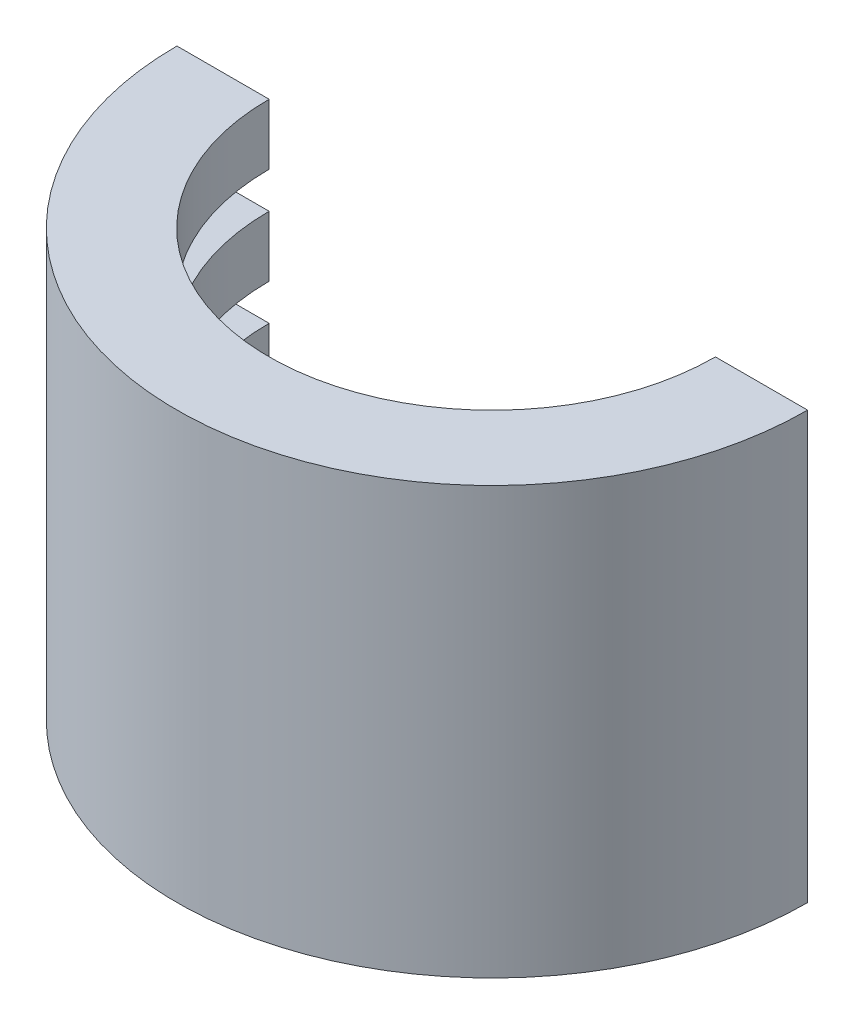
ISO-10303-21;
HEADER;
FILE_DESCRIPTION(('STEP AP214'),'2;1');
FILE_NAME('part.step','',(''),(''),'','','');
FILE_SCHEMA(('AUTOMOTIVE_DESIGN { 1 0 10303 214 1 1 1 1 }'));
ENDSEC;
DATA;
#1=APPLICATION_CONTEXT('core data for automotive mechanical design processes');
#2=APPLICATION_PROTOCOL_DEFINITION('international standard','automotive_design',2000,#1);
#3=PRODUCT_CONTEXT('',#1,'mechanical');
#4=PRODUCT('Part','Part','',(#3));
#5=PRODUCT_RELATED_PRODUCT_CATEGORY('part','',(#4));
#6=PRODUCT_DEFINITION_FORMATION('','',#4);
#7=PRODUCT_DEFINITION_CONTEXT('part definition',#1,'design');
#8=PRODUCT_DEFINITION('design','',#6,#7);
#9=PRODUCT_DEFINITION_SHAPE('','',#8);
#10=(LENGTH_UNIT() NAMED_UNIT(*) SI_UNIT(.MILLI.,.METRE.));
#11=(NAMED_UNIT(*) PLANE_ANGLE_UNIT() SI_UNIT($,.RADIAN.));
#12=(NAMED_UNIT(*) SI_UNIT($,.STERADIAN.) SOLID_ANGLE_UNIT());
#13=UNCERTAINTY_MEASURE_WITH_UNIT(LENGTH_MEASURE(1.E-05),#10,'distance_accuracy_value','');
#14=(GEOMETRIC_REPRESENTATION_CONTEXT(3) GLOBAL_UNCERTAINTY_ASSIGNED_CONTEXT((#13)) GLOBAL_UNIT_ASSIGNED_CONTEXT((#10,
#11,#12)) REPRESENTATION_CONTEXT('',''));
#15=CARTESIAN_POINT('',(0.,0.,0.));
#16=DIRECTION('',(0.,0.,1.));
#17=DIRECTION('',(1.,0.,0.));
#18=AXIS2_PLACEMENT_3D('',#15,#16,#17);
#19=CARTESIAN_POINT('',(0.,2.,0.));
#20=DIRECTION('',(0.,1.,0.));
#21=DIRECTION('',(-1.,0.,0.));
#22=AXIS2_PLACEMENT_3D('',#19,#20,#21);
#23=PLANE('',#22);
#24=DIRECTION('',(1.,0.,0.));
#25=VECTOR('',#24,1.);
#26=CARTESIAN_POINT('',(0.,2.,0.));
#27=LINE('',#26,#25);
#28=CARTESIAN_POINT('',(-1.5,2.,0.));
#29=VERTEX_POINT('',#28);
#30=CARTESIAN_POINT('',(1.5,2.,0.));
#31=VERTEX_POINT('',#30);
#32=EDGE_CURVE('E201',#29,#31,#27,.T.);
#33=ORIENTED_EDGE('',*,*,#32,.F.);
#34=CARTESIAN_POINT('',(0.,2.,0.));
#35=DIRECTION('',(0.,1.,0.));
#36=DIRECTION('',(-1.,0.,0.));
#37=AXIS2_PLACEMENT_3D('',#34,#35,#36);
#38=CIRCLE('',#37,1.5);
#39=EDGE_CURVE('E209',#29,#31,#38,.T.);
#40=ORIENTED_EDGE('',*,*,#39,.T.);
#41=EDGE_LOOP('',(#33,#40));
#42=FACE_BOUND('',#41,.T.);
#43=ADVANCED_FACE('F37',(#42),#23,.T.);
#44=CARTESIAN_POINT('',(0.,-1.58456842119819,0.));
#45=DIRECTION('',(0.,1.,0.));
#46=DIRECTION('',(-1.,0.,0.));
#47=AXIS2_PLACEMENT_3D('',#44,#45,#46);
#48=PLANE('',#47);
#49=CARTESIAN_POINT('',(0.,-1.58456842119819,0.));
#50=DIRECTION('',(0.,1.,0.));
#51=DIRECTION('',(-1.,0.,0.));
#52=AXIS2_PLACEMENT_3D('',#49,#50,#51);
#53=CIRCLE('',#52,13.);
#54=CARTESIAN_POINT('',(-13.,-1.58456842119818,0.));
#55=VERTEX_POINT('',#54);
#56=CARTESIAN_POINT('',(13.,-1.58456842119818,0.));
#57=VERTEX_POINT('',#56);
#58=EDGE_CURVE('E194',#55,#57,#53,.T.);
#59=ORIENTED_EDGE('',*,*,#58,.F.);
#60=DIRECTION('',(1.,0.,0.));
#61=VECTOR('',#60,1.);
#62=CARTESIAN_POINT('',(0.,-1.58456842119819,0.));
#63=LINE('',#62,#61);
#64=EDGE_CURVE('E175',#55,#57,#63,.T.);
#65=ORIENTED_EDGE('',*,*,#64,.T.);
#66=EDGE_LOOP('',(#59,#65));
#67=FACE_BOUND('',#66,.T.);
#68=ADVANCED_FACE('F342',(#67),#48,.F.);
#69=CARTESIAN_POINT('',(0.,18.,0.));
#70=DIRECTION('',(0.,1.,0.));
#71=DIRECTION('',(-1.,0.,0.));
#72=AXIS2_PLACEMENT_3D('',#69,#70,#71);
#73=CYLINDRICAL_SURFACE('',#72,13.);
#74=DIRECTION('',(0.,1.,0.));
#75=VECTOR('',#74,1.);
#76=CARTESIAN_POINT('',(13.,-4.,0.));
#77=LINE('',#76,#75);
#78=CARTESIAN_POINT('',(13.,16.,0.));
#79=VERTEX_POINT('',#78);
#80=EDGE_CURVE('E180',#57,#79,#77,.T.);
#81=ORIENTED_EDGE('',*,*,#80,.T.);
#82=CARTESIAN_POINT('',(0.,16.,0.));
#83=DIRECTION('',(0.,1.,0.));
#84=DIRECTION('',(-1.,0.,0.));
#85=AXIS2_PLACEMENT_3D('',#82,#83,#84);
#86=CIRCLE('',#85,13.);
#87=CARTESIAN_POINT('',(-13.,16.,0.));
#88=VERTEX_POINT('',#87);
#89=EDGE_CURVE('E187',#88,#79,#86,.T.);
#90=ORIENTED_EDGE('',*,*,#89,.F.);
#91=DIRECTION('',(0.,1.,0.));
#92=VECTOR('',#91,1.);
#93=CARTESIAN_POINT('',(-13.,-4.,0.));
#94=LINE('',#93,#92);
#95=EDGE_CURVE('E169',#55,#88,#94,.T.);
#96=ORIENTED_EDGE('',*,*,#95,.F.);
#97=ORIENTED_EDGE('',*,*,#58,.T.);
#98=EDGE_LOOP('',(#81,#90,#96,#97));
#99=FACE_BOUND('',#98,.T.);
#100=ADVANCED_FACE('F193',(#99),#73,.T.);
#101=CARTESIAN_POINT('',(0.,16.,0.));
#102=DIRECTION('',(0.,-1.,0.));
#103=DIRECTION('',(1.,0.,0.));
#104=AXIS2_PLACEMENT_3D('',#101,#102,#103);
#105=PLANE('',#104);
#106=ORIENTED_EDGE('',*,*,#89,.T.);
#107=DIRECTION('',(1.,0.,0.));
#108=VECTOR('',#107,1.);
#109=CARTESIAN_POINT('',(-13.,16.,0.));
#110=LINE('',#109,#108);
#111=CARTESIAN_POINT('',(9.2,16.,0.));
#112=VERTEX_POINT('',#111);
#113=EDGE_CURVE('E190',#112,#79,#110,.T.);
#114=ORIENTED_EDGE('',*,*,#113,.F.);
#115=CARTESIAN_POINT('',(0.,16.,0.));
#116=DIRECTION('',(0.,1.,0.));
#117=DIRECTION('',(-1.,0.,0.));
#118=AXIS2_PLACEMENT_3D('',#115,#116,#117);
#119=CIRCLE('',#118,9.2);
#120=CARTESIAN_POINT('',(-9.2,16.,0.));
#121=VERTEX_POINT('',#120);
#122=EDGE_CURVE('E189',#121,#112,#119,.T.);
#123=ORIENTED_EDGE('',*,*,#122,.F.);
#124=EDGE_CURVE('E172',#88,#121,#110,.T.);
#125=ORIENTED_EDGE('',*,*,#124,.F.);
#126=EDGE_LOOP('',(#106,#114,#123,#125));
#127=FACE_BOUND('',#126,.T.);
#128=ADVANCED_FACE('F185',(#127),#105,.F.);
#129=CARTESIAN_POINT('',(0.,18.,0.));
#130=DIRECTION('',(0.,1.,0.));
#131=DIRECTION('',(-1.,0.,0.));
#132=AXIS2_PLACEMENT_3D('',#129,#130,#131);
#133=CYLINDRICAL_SURFACE('',#132,9.2);
#134=DIRECTION('',(0.,1.,0.));
#135=VECTOR('',#134,1.);
#136=CARTESIAN_POINT('',(9.2,18.,0.));
#137=LINE('',#136,#135);
#138=CARTESIAN_POINT('',(9.2,13.5,0.));
#139=VERTEX_POINT('',#138);
#140=EDGE_CURVE('E218',#139,#112,#137,.T.);
#141=ORIENTED_EDGE('',*,*,#140,.F.);
#142=CARTESIAN_POINT('',(0.,13.5,0.));
#143=DIRECTION('',(0.,1.,0.));
#144=DIRECTION('',(-1.,0.,0.));
#145=AXIS2_PLACEMENT_3D('',#142,#143,#144);
#146=CIRCLE('',#145,9.2);
#147=CARTESIAN_POINT('',(-9.2,13.5,0.));
#148=VERTEX_POINT('',#147);
#149=EDGE_CURVE('E197',#148,#139,#146,.T.);
#150=ORIENTED_EDGE('',*,*,#149,.F.);
#151=DIRECTION('',(0.,1.,0.));
#152=VECTOR('',#151,1.);
#153=CARTESIAN_POINT('',(-9.2,18.,0.));
#154=LINE('',#153,#152);
#155=EDGE_CURVE('E211',#121,#148,#154,.F.);
#156=ORIENTED_EDGE('',*,*,#155,.F.);
#157=ORIENTED_EDGE('',*,*,#122,.T.);
#158=EDGE_LOOP('',(#141,#150,#156,#157));
#159=FACE_BOUND('',#158,.T.);
#160=ADVANCED_FACE('F270',(#159),#133,.F.);
#161=CARTESIAN_POINT('',(0.,13.5,0.));
#162=DIRECTION('',(0.,-1.,0.));
#163=DIRECTION('',(1.,0.,0.));
#164=AXIS2_PLACEMENT_3D('',#161,#162,#163);
#165=PLANE('',#164);
#166=DIRECTION('',(-1.,0.,0.));
#167=VECTOR('',#166,1.);
#168=CARTESIAN_POINT('',(0.,13.5,0.));
#169=LINE('',#168,#167);
#170=CARTESIAN_POINT('',(11.,13.5,0.));
#171=VERTEX_POINT('',#170);
#172=EDGE_CURVE('E58',#171,#139,#169,.T.);
#173=ORIENTED_EDGE('',*,*,#172,.F.);
#174=CARTESIAN_POINT('',(0.,13.5,0.));
#175=DIRECTION('',(0.,1.,0.));
#176=DIRECTION('',(-1.,0.,0.));
#177=AXIS2_PLACEMENT_3D('',#174,#175,#176);
#178=CIRCLE('',#177,11.);
#179=CARTESIAN_POINT('',(-11.,13.5,0.));
#180=VERTEX_POINT('',#179);
#181=EDGE_CURVE('E260',#180,#171,#178,.T.);
#182=ORIENTED_EDGE('',*,*,#181,.F.);
#183=EDGE_CURVE('E268',#148,#180,#169,.T.);
#184=ORIENTED_EDGE('',*,*,#183,.F.);
#185=ORIENTED_EDGE('',*,*,#149,.T.);
#186=EDGE_LOOP('',(#173,#182,#184,#185));
#187=FACE_BOUND('',#186,.T.);
#188=ADVANCED_FACE('F266',(#187),#165,.T.);
#189=CARTESIAN_POINT('',(0.,18.,0.));
#190=DIRECTION('',(0.,1.,0.));
#191=DIRECTION('',(-1.,0.,0.));
#192=AXIS2_PLACEMENT_3D('',#189,#190,#191);
#193=CYLINDRICAL_SURFACE('',#192,11.);
#194=DIRECTION('',(0.,1.,0.));
#195=VECTOR('',#194,1.);
#196=CARTESIAN_POINT('',(11.,18.,0.));
#197=LINE('',#196,#195);
#198=CARTESIAN_POINT('',(11.,12.,0.));
#199=VERTEX_POINT('',#198);
#200=EDGE_CURVE('E271',#199,#171,#197,.T.);
#201=ORIENTED_EDGE('',*,*,#200,.F.);
#202=CARTESIAN_POINT('',(0.,12.,0.));
#203=DIRECTION('',(0.,1.,0.));
#204=DIRECTION('',(-1.,0.,0.));
#205=AXIS2_PLACEMENT_3D('',#202,#203,#204);
#206=CIRCLE('',#205,11.);
#207=CARTESIAN_POINT('',(-11.,12.,0.));
#208=VERTEX_POINT('',#207);
#209=EDGE_CURVE('E257',#208,#199,#206,.T.);
#210=ORIENTED_EDGE('',*,*,#209,.F.);
#211=DIRECTION('',(0.,1.,0.));
#212=VECTOR('',#211,1.);
#213=CARTESIAN_POINT('',(-11.,18.,0.));
#214=LINE('',#213,#212);
#215=EDGE_CURVE('E294',#180,#208,#214,.F.);
#216=ORIENTED_EDGE('',*,*,#215,.F.);
#217=ORIENTED_EDGE('',*,*,#181,.T.);
#218=EDGE_LOOP('',(#201,#210,#216,#217));
#219=FACE_BOUND('',#218,.T.);
#220=ADVANCED_FACE('F358',(#219),#193,.F.);
#221=CARTESIAN_POINT('',(0.,12.,0.));
#222=DIRECTION('',(0.,1.,0.));
#223=DIRECTION('',(-1.,0.,0.));
#224=AXIS2_PLACEMENT_3D('',#221,#222,#223);
#225=PLANE('',#224);
#226=DIRECTION('',(1.,0.,0.));
#227=VECTOR('',#226,1.);
#228=CARTESIAN_POINT('',(0.,12.,0.));
#229=LINE('',#228,#227);
#230=CARTESIAN_POINT('',(-9.2,12.,0.));
#231=VERTEX_POINT('',#230);
#232=EDGE_CURVE('E296',#208,#231,#229,.T.);
#233=ORIENTED_EDGE('',*,*,#232,.F.);
#234=ORIENTED_EDGE('',*,*,#209,.T.);
#235=CARTESIAN_POINT('',(9.2,12.,0.));
#236=VERTEX_POINT('',#235);
#237=EDGE_CURVE('E275',#236,#199,#229,.T.);
#238=ORIENTED_EDGE('',*,*,#237,.F.);
#239=CARTESIAN_POINT('',(0.,12.,0.));
#240=DIRECTION('',(0.,1.,0.));
#241=DIRECTION('',(-1.,0.,0.));
#242=AXIS2_PLACEMENT_3D('',#239,#240,#241);
#243=CIRCLE('',#242,9.2);
#244=EDGE_CURVE('E254',#231,#236,#243,.T.);
#245=ORIENTED_EDGE('',*,*,#244,.F.);
#246=EDGE_LOOP('',(#233,#234,#238,#245));
#247=FACE_BOUND('',#246,.T.);
#248=ADVANCED_FACE('F361',(#247),#225,.T.);
#249=CARTESIAN_POINT('',(0.,18.,0.));
#250=DIRECTION('',(0.,1.,0.));
#251=DIRECTION('',(-1.,0.,0.));
#252=AXIS2_PLACEMENT_3D('',#249,#250,#251);
#253=CYLINDRICAL_SURFACE('',#252,9.2);
#254=DIRECTION('',(0.,1.,0.));
#255=VECTOR('',#254,1.);
#256=CARTESIAN_POINT('',(9.2,18.,0.));
#257=LINE('',#256,#255);
#258=CARTESIAN_POINT('',(9.2,9.5,0.));
#259=VERTEX_POINT('',#258);
#260=EDGE_CURVE('E276',#259,#236,#257,.T.);
#261=ORIENTED_EDGE('',*,*,#260,.F.);
#262=CARTESIAN_POINT('',(0.,9.5,0.));
#263=DIRECTION('',(0.,1.,0.));
#264=DIRECTION('',(-1.,0.,0.));
#265=AXIS2_PLACEMENT_3D('',#262,#263,#264);
#266=CIRCLE('',#265,9.2);
#267=CARTESIAN_POINT('',(-9.2,9.5,0.));
#268=VERTEX_POINT('',#267);
#269=EDGE_CURVE('E251',#268,#259,#266,.T.);
#270=ORIENTED_EDGE('',*,*,#269,.F.);
#271=DIRECTION('',(0.,1.,0.));
#272=VECTOR('',#271,1.);
#273=CARTESIAN_POINT('',(-9.2,18.,0.));
#274=LINE('',#273,#272);
#275=EDGE_CURVE('E298',#231,#268,#274,.F.);
#276=ORIENTED_EDGE('',*,*,#275,.F.);
#277=ORIENTED_EDGE('',*,*,#244,.T.);
#278=EDGE_LOOP('',(#261,#270,#276,#277));
#279=FACE_BOUND('',#278,.T.);
#280=ADVANCED_FACE('F365',(#279),#253,.F.);
#281=CARTESIAN_POINT('',(0.,9.5,0.));
#282=DIRECTION('',(0.,-1.,0.));
#283=DIRECTION('',(1.,0.,0.));
#284=AXIS2_PLACEMENT_3D('',#281,#282,#283);
#285=PLANE('',#284);
#286=DIRECTION('',(-1.,0.,0.));
#287=VECTOR('',#286,1.);
#288=CARTESIAN_POINT('',(0.,9.5,0.));
#289=LINE('',#288,#287);
#290=CARTESIAN_POINT('',(11.,9.5,0.));
#291=VERTEX_POINT('',#290);
#292=EDGE_CURVE('E278',#291,#259,#289,.T.);
#293=ORIENTED_EDGE('',*,*,#292,.F.);
#294=CARTESIAN_POINT('',(0.,9.5,0.));
#295=DIRECTION('',(0.,1.,0.));
#296=DIRECTION('',(-1.,0.,0.));
#297=AXIS2_PLACEMENT_3D('',#294,#295,#296);
#298=CIRCLE('',#297,11.);
#299=CARTESIAN_POINT('',(-11.,9.5,0.));
#300=VERTEX_POINT('',#299);
#301=EDGE_CURVE('E248',#300,#291,#298,.T.);
#302=ORIENTED_EDGE('',*,*,#301,.F.);
#303=EDGE_CURVE('E300',#268,#300,#289,.T.);
#304=ORIENTED_EDGE('',*,*,#303,.F.);
#305=ORIENTED_EDGE('',*,*,#269,.T.);
#306=EDGE_LOOP('',(#293,#302,#304,#305));
#307=FACE_BOUND('',#306,.T.);
#308=ADVANCED_FACE('F369',(#307),#285,.T.);
#309=CARTESIAN_POINT('',(0.,18.,0.));
#310=DIRECTION('',(0.,1.,0.));
#311=DIRECTION('',(-1.,0.,0.));
#312=AXIS2_PLACEMENT_3D('',#309,#310,#311);
#313=CYLINDRICAL_SURFACE('',#312,11.);
#314=DIRECTION('',(0.,1.,0.));
#315=VECTOR('',#314,1.);
#316=CARTESIAN_POINT('',(11.,18.,0.));
#317=LINE('',#316,#315);
#318=CARTESIAN_POINT('',(11.,8.,0.));
#319=VERTEX_POINT('',#318);
#320=EDGE_CURVE('E279',#319,#291,#317,.T.);
#321=ORIENTED_EDGE('',*,*,#320,.F.);
#322=CARTESIAN_POINT('',(0.,8.,0.));
#323=DIRECTION('',(0.,1.,0.));
#324=DIRECTION('',(-1.,0.,0.));
#325=AXIS2_PLACEMENT_3D('',#322,#323,#324);
#326=CIRCLE('',#325,11.);
#327=CARTESIAN_POINT('',(-11.,8.,0.));
#328=VERTEX_POINT('',#327);
#329=EDGE_CURVE('E245',#328,#319,#326,.T.);
#330=ORIENTED_EDGE('',*,*,#329,.F.);
#331=DIRECTION('',(0.,1.,0.));
#332=VECTOR('',#331,1.);
#333=CARTESIAN_POINT('',(-11.,18.,0.));
#334=LINE('',#333,#332);
#335=EDGE_CURVE('E302',#300,#328,#334,.F.);
#336=ORIENTED_EDGE('',*,*,#335,.F.);
#337=ORIENTED_EDGE('',*,*,#301,.T.);
#338=EDGE_LOOP('',(#321,#330,#336,#337));
#339=FACE_BOUND('',#338,.T.);
#340=ADVANCED_FACE('F373',(#339),#313,.F.);
#341=CARTESIAN_POINT('',(0.,8.,0.));
#342=DIRECTION('',(0.,1.,0.));
#343=DIRECTION('',(-1.,0.,0.));
#344=AXIS2_PLACEMENT_3D('',#341,#342,#343);
#345=PLANE('',#344);
#346=DIRECTION('',(1.,0.,0.));
#347=VECTOR('',#346,1.);
#348=CARTESIAN_POINT('',(0.,8.,0.));
#349=LINE('',#348,#347);
#350=CARTESIAN_POINT('',(-9.2,8.,0.));
#351=VERTEX_POINT('',#350);
#352=EDGE_CURVE('E304',#328,#351,#349,.T.);
#353=ORIENTED_EDGE('',*,*,#352,.F.);
#354=ORIENTED_EDGE('',*,*,#329,.T.);
#355=CARTESIAN_POINT('',(9.2,8.,0.));
#356=VERTEX_POINT('',#355);
#357=EDGE_CURVE('E281',#356,#319,#349,.T.);
#358=ORIENTED_EDGE('',*,*,#357,.F.);
#359=CARTESIAN_POINT('',(0.,8.,0.));
#360=DIRECTION('',(0.,1.,0.));
#361=DIRECTION('',(-1.,0.,0.));
#362=AXIS2_PLACEMENT_3D('',#359,#360,#361);
#363=CIRCLE('',#362,9.2);
#364=EDGE_CURVE('E242',#351,#356,#363,.T.);
#365=ORIENTED_EDGE('',*,*,#364,.F.);
#366=EDGE_LOOP('',(#353,#354,#358,#365));
#367=FACE_BOUND('',#366,.T.);
#368=ADVANCED_FACE('F377',(#367),#345,.T.);
#369=CARTESIAN_POINT('',(0.,18.,0.));
#370=DIRECTION('',(0.,1.,0.));
#371=DIRECTION('',(-1.,0.,0.));
#372=AXIS2_PLACEMENT_3D('',#369,#370,#371);
#373=CYLINDRICAL_SURFACE('',#372,9.2);
#374=DIRECTION('',(0.,1.,0.));
#375=VECTOR('',#374,1.);
#376=CARTESIAN_POINT('',(9.2,18.,0.));
#377=LINE('',#376,#375);
#378=CARTESIAN_POINT('',(9.2,5.5,0.));
#379=VERTEX_POINT('',#378);
#380=EDGE_CURVE('E282',#379,#356,#377,.T.);
#381=ORIENTED_EDGE('',*,*,#380,.F.);
#382=CARTESIAN_POINT('',(0.,5.5,0.));
#383=DIRECTION('',(0.,1.,0.));
#384=DIRECTION('',(-1.,0.,0.));
#385=AXIS2_PLACEMENT_3D('',#382,#383,#384);
#386=CIRCLE('',#385,9.2);
#387=CARTESIAN_POINT('',(-9.2,5.5,0.));
#388=VERTEX_POINT('',#387);
#389=EDGE_CURVE('E239',#388,#379,#386,.T.);
#390=ORIENTED_EDGE('',*,*,#389,.F.);
#391=DIRECTION('',(0.,1.,0.));
#392=VECTOR('',#391,1.);
#393=CARTESIAN_POINT('',(-9.2,18.,0.));
#394=LINE('',#393,#392);
#395=EDGE_CURVE('E306',#351,#388,#394,.F.);
#396=ORIENTED_EDGE('',*,*,#395,.F.);
#397=ORIENTED_EDGE('',*,*,#364,.T.);
#398=EDGE_LOOP('',(#381,#390,#396,#397));
#399=FACE_BOUND('',#398,.T.);
#400=ADVANCED_FACE('F381',(#399),#373,.F.);
#401=CARTESIAN_POINT('',(0.,5.5,0.));
#402=DIRECTION('',(0.,-1.,0.));
#403=DIRECTION('',(1.,0.,0.));
#404=AXIS2_PLACEMENT_3D('',#401,#402,#403);
#405=PLANE('',#404);
#406=DIRECTION('',(-1.,0.,0.));
#407=VECTOR('',#406,1.);
#408=CARTESIAN_POINT('',(0.,5.5,0.));
#409=LINE('',#408,#407);
#410=CARTESIAN_POINT('',(11.,5.5,0.));
#411=VERTEX_POINT('',#410);
#412=EDGE_CURVE('E284',#411,#379,#409,.T.);
#413=ORIENTED_EDGE('',*,*,#412,.F.);
#414=CARTESIAN_POINT('',(0.,5.5,0.));
#415=DIRECTION('',(0.,1.,0.));
#416=DIRECTION('',(-1.,0.,0.));
#417=AXIS2_PLACEMENT_3D('',#414,#415,#416);
#418=CIRCLE('',#417,11.);
#419=CARTESIAN_POINT('',(-11.,5.5,0.));
#420=VERTEX_POINT('',#419);
#421=EDGE_CURVE('E236',#420,#411,#418,.T.);
#422=ORIENTED_EDGE('',*,*,#421,.F.);
#423=EDGE_CURVE('E308',#388,#420,#409,.T.);
#424=ORIENTED_EDGE('',*,*,#423,.F.);
#425=ORIENTED_EDGE('',*,*,#389,.T.);
#426=EDGE_LOOP('',(#413,#422,#424,#425));
#427=FACE_BOUND('',#426,.T.);
#428=ADVANCED_FACE('F385',(#427),#405,.T.);
#429=CARTESIAN_POINT('',(0.,18.,0.));
#430=DIRECTION('',(0.,1.,0.));
#431=DIRECTION('',(-1.,0.,0.));
#432=AXIS2_PLACEMENT_3D('',#429,#430,#431);
#433=CYLINDRICAL_SURFACE('',#432,11.);
#434=DIRECTION('',(0.,1.,0.));
#435=VECTOR('',#434,1.);
#436=CARTESIAN_POINT('',(11.,18.,0.));
#437=LINE('',#436,#435);
#438=CARTESIAN_POINT('',(11.,4.,0.));
#439=VERTEX_POINT('',#438);
#440=EDGE_CURVE('E285',#439,#411,#437,.T.);
#441=ORIENTED_EDGE('',*,*,#440,.F.);
#442=CARTESIAN_POINT('',(0.,4.,0.));
#443=DIRECTION('',(0.,1.,0.));
#444=DIRECTION('',(-1.,0.,0.));
#445=AXIS2_PLACEMENT_3D('',#442,#443,#444);
#446=CIRCLE('',#445,11.);
#447=CARTESIAN_POINT('',(-11.,4.,0.));
#448=VERTEX_POINT('',#447);
#449=EDGE_CURVE('E233',#448,#439,#446,.T.);
#450=ORIENTED_EDGE('',*,*,#449,.F.);
#451=DIRECTION('',(0.,1.,0.));
#452=VECTOR('',#451,1.);
#453=CARTESIAN_POINT('',(-11.,18.,0.));
#454=LINE('',#453,#452);
#455=EDGE_CURVE('E310',#420,#448,#454,.F.);
#456=ORIENTED_EDGE('',*,*,#455,.F.);
#457=ORIENTED_EDGE('',*,*,#421,.T.);
#458=EDGE_LOOP('',(#441,#450,#456,#457));
#459=FACE_BOUND('',#458,.T.);
#460=ADVANCED_FACE('F389',(#459),#433,.F.);
#461=CARTESIAN_POINT('',(0.,4.,0.));
#462=DIRECTION('',(0.,1.,0.));
#463=DIRECTION('',(-1.,0.,0.));
#464=AXIS2_PLACEMENT_3D('',#461,#462,#463);
#465=PLANE('',#464);
#466=DIRECTION('',(1.,0.,0.));
#467=VECTOR('',#466,1.);
#468=CARTESIAN_POINT('',(0.,4.,0.));
#469=LINE('',#468,#467);
#470=CARTESIAN_POINT('',(-9.2,4.,0.));
#471=VERTEX_POINT('',#470);
#472=EDGE_CURVE('E312',#448,#471,#469,.T.);
#473=ORIENTED_EDGE('',*,*,#472,.F.);
#474=ORIENTED_EDGE('',*,*,#449,.T.);
#475=CARTESIAN_POINT('',(9.2,4.,0.));
#476=VERTEX_POINT('',#475);
#477=EDGE_CURVE('E287',#476,#439,#469,.T.);
#478=ORIENTED_EDGE('',*,*,#477,.F.);
#479=CARTESIAN_POINT('',(0.,4.,0.));
#480=DIRECTION('',(0.,1.,0.));
#481=DIRECTION('',(-1.,0.,0.));
#482=AXIS2_PLACEMENT_3D('',#479,#480,#481);
#483=CIRCLE('',#482,9.2);
#484=EDGE_CURVE('E230',#471,#476,#483,.T.);
#485=ORIENTED_EDGE('',*,*,#484,.F.);
#486=EDGE_LOOP('',(#473,#474,#478,#485));
#487=FACE_BOUND('',#486,.T.);
#488=ADVANCED_FACE('F393',(#487),#465,.T.);
#489=CARTESIAN_POINT('',(0.,18.,0.));
#490=DIRECTION('',(0.,1.,0.));
#491=DIRECTION('',(-1.,0.,0.));
#492=AXIS2_PLACEMENT_3D('',#489,#490,#491);
#493=CYLINDRICAL_SURFACE('',#492,9.2);
#494=DIRECTION('',(0.,1.,0.));
#495=VECTOR('',#494,1.);
#496=CARTESIAN_POINT('',(9.2,18.,0.));
#497=LINE('',#496,#495);
#498=CARTESIAN_POINT('',(9.2,1.5,0.));
#499=VERTEX_POINT('',#498);
#500=EDGE_CURVE('E288',#499,#476,#497,.T.);
#501=ORIENTED_EDGE('',*,*,#500,.F.);
#502=CARTESIAN_POINT('',(0.,1.5,0.));
#503=DIRECTION('',(0.,1.,0.));
#504=DIRECTION('',(-1.,0.,0.));
#505=AXIS2_PLACEMENT_3D('',#502,#503,#504);
#506=CIRCLE('',#505,9.2);
#507=CARTESIAN_POINT('',(-9.2,1.5,0.));
#508=VERTEX_POINT('',#507);
#509=EDGE_CURVE('E227',#508,#499,#506,.T.);
#510=ORIENTED_EDGE('',*,*,#509,.F.);
#511=DIRECTION('',(0.,1.,0.));
#512=VECTOR('',#511,1.);
#513=CARTESIAN_POINT('',(-9.2,18.,0.));
#514=LINE('',#513,#512);
#515=EDGE_CURVE('E314',#471,#508,#514,.F.);
#516=ORIENTED_EDGE('',*,*,#515,.F.);
#517=ORIENTED_EDGE('',*,*,#484,.T.);
#518=EDGE_LOOP('',(#501,#510,#516,#517));
#519=FACE_BOUND('',#518,.T.);
#520=ADVANCED_FACE('F397',(#519),#493,.F.);
#521=CARTESIAN_POINT('',(0.,1.5,0.));
#522=DIRECTION('',(0.,1.,0.));
#523=DIRECTION('',(-1.,0.,0.));
#524=AXIS2_PLACEMENT_3D('',#521,#522,#523);
#525=PLANE('',#524);
#526=CARTESIAN_POINT('',(0.,1.5,0.));
#527=DIRECTION('',(0.,1.,0.));
#528=DIRECTION('',(-1.,0.,0.));
#529=AXIS2_PLACEMENT_3D('',#526,#527,#528);
#530=CIRCLE('',#529,11.);
#531=CARTESIAN_POINT('',(-11.,1.5,0.));
#532=VERTEX_POINT('',#531);
#533=CARTESIAN_POINT('',(11.,1.5,0.));
#534=VERTEX_POINT('',#533);
#535=EDGE_CURVE('E224',#532,#534,#530,.T.);
#536=ORIENTED_EDGE('',*,*,#535,.F.);
#537=DIRECTION('',(1.,0.,0.));
#538=VECTOR('',#537,1.);
#539=CARTESIAN_POINT('',(0.,1.5,0.));
#540=LINE('',#539,#538);
#541=EDGE_CURVE('E316',#532,#508,#540,.T.);
#542=ORIENTED_EDGE('',*,*,#541,.T.);
#543=ORIENTED_EDGE('',*,*,#509,.T.);
#544=EDGE_CURVE('E290',#499,#534,#540,.T.);
#545=ORIENTED_EDGE('',*,*,#544,.T.);
#546=EDGE_LOOP('',(#536,#542,#543,#545));
#547=FACE_BOUND('',#546,.T.);
#548=ADVANCED_FACE('F339',(#547),#525,.F.);
#549=CARTESIAN_POINT('',(0.,18.,0.));
#550=DIRECTION('',(0.,1.,0.));
#551=DIRECTION('',(-1.,0.,0.));
#552=AXIS2_PLACEMENT_3D('',#549,#550,#551);
#553=CYLINDRICAL_SURFACE('',#552,11.);
#554=DIRECTION('',(0.,1.,0.));
#555=VECTOR('',#554,1.);
#556=CARTESIAN_POINT('',(11.,18.,0.));
#557=LINE('',#556,#555);
#558=CARTESIAN_POINT('',(11.,0.,0.));
#559=VERTEX_POINT('',#558);
#560=EDGE_CURVE('E291',#559,#534,#557,.T.);
#561=ORIENTED_EDGE('',*,*,#560,.F.);
#562=CARTESIAN_POINT('',(0.,0.,0.));
#563=DIRECTION('',(0.,1.,0.));
#564=DIRECTION('',(-1.,0.,0.));
#565=AXIS2_PLACEMENT_3D('',#562,#563,#564);
#566=CIRCLE('',#565,11.);
#567=CARTESIAN_POINT('',(-11.,0.,0.));
#568=VERTEX_POINT('',#567);
#569=EDGE_CURVE('E216',#568,#559,#566,.T.);
#570=ORIENTED_EDGE('',*,*,#569,.F.);
#571=DIRECTION('',(0.,1.,0.));
#572=VECTOR('',#571,1.);
#573=CARTESIAN_POINT('',(-11.,18.,0.));
#574=LINE('',#573,#572);
#575=EDGE_CURVE('E319',#532,#568,#574,.F.);
#576=ORIENTED_EDGE('',*,*,#575,.F.);
#577=ORIENTED_EDGE('',*,*,#535,.T.);
#578=EDGE_LOOP('',(#561,#570,#576,#577));
#579=FACE_BOUND('',#578,.T.);
#580=ADVANCED_FACE('F328',(#579),#553,.F.);
#581=CARTESIAN_POINT('',(0.,0.,0.));
#582=DIRECTION('',(0.,1.,0.));
#583=DIRECTION('',(-1.,0.,0.));
#584=AXIS2_PLACEMENT_3D('',#581,#582,#583);
#585=PLANE('',#584);
#586=DIRECTION('',(1.,0.,0.));
#587=VECTOR('',#586,1.);
#588=CARTESIAN_POINT('',(0.,0.,0.));
#589=LINE('',#588,#587);
#590=CARTESIAN_POINT('',(-1.5,0.,0.));
#591=VERTEX_POINT('',#590);
#592=EDGE_CURVE('E51',#568,#591,#589,.T.);
#593=ORIENTED_EDGE('',*,*,#592,.F.);
#594=ORIENTED_EDGE('',*,*,#569,.T.);
#595=CARTESIAN_POINT('',(1.5,0.,0.));
#596=VERTEX_POINT('',#595);
#597=EDGE_CURVE('E210',#596,#559,#589,.T.);
#598=ORIENTED_EDGE('',*,*,#597,.F.);
#599=CARTESIAN_POINT('',(0.,0.,0.));
#600=DIRECTION('',(0.,1.,0.));
#601=DIRECTION('',(-1.,0.,0.));
#602=AXIS2_PLACEMENT_3D('',#599,#600,#601);
#603=CIRCLE('',#602,1.5);
#604=EDGE_CURVE('E214',#591,#596,#603,.T.);
#605=ORIENTED_EDGE('',*,*,#604,.F.);
#606=EDGE_LOOP('',(#593,#594,#598,#605));
#607=FACE_BOUND('',#606,.T.);
#608=ADVANCED_FACE('F331',(#607),#585,.T.);
#609=CARTESIAN_POINT('',(0.,18.,0.));
#610=DIRECTION('',(0.,1.,0.));
#611=DIRECTION('',(-1.,0.,0.));
#612=AXIS2_PLACEMENT_3D('',#609,#610,#611);
#613=CYLINDRICAL_SURFACE('',#612,1.5);
#614=DIRECTION('',(0.,1.,0.));
#615=VECTOR('',#614,1.);
#616=CARTESIAN_POINT('',(1.5,18.,0.));
#617=LINE('',#616,#615);
#618=EDGE_CURVE('E11',#31,#596,#617,.F.);
#619=ORIENTED_EDGE('',*,*,#618,.F.);
#620=ORIENTED_EDGE('',*,*,#39,.F.);
#621=DIRECTION('',(0.,1.,0.));
#622=VECTOR('',#621,1.);
#623=CARTESIAN_POINT('',(-1.5,18.,0.));
#624=LINE('',#623,#622);
#625=EDGE_CURVE('E44',#591,#29,#624,.T.);
#626=ORIENTED_EDGE('',*,*,#625,.F.);
#627=ORIENTED_EDGE('',*,*,#604,.T.);
#628=EDGE_LOOP('',(#619,#620,#626,#627));
#629=FACE_BOUND('',#628,.T.);
#630=ADVANCED_FACE('F213',(#629),#613,.T.);
#631=CARTESIAN_POINT('',(-13.,-4.,0.));
#632=DIRECTION('',(0.,0.,1.));
#633=DIRECTION('',(1.,0.,0.));
#634=AXIS2_PLACEMENT_3D('',#631,#632,#633);
#635=PLANE('',#634);
#636=ORIENTED_EDGE('',*,*,#95,.T.);
#637=ORIENTED_EDGE('',*,*,#124,.T.);
#638=ORIENTED_EDGE('',*,*,#155,.T.);
#639=ORIENTED_EDGE('',*,*,#183,.T.);
#640=ORIENTED_EDGE('',*,*,#215,.T.);
#641=ORIENTED_EDGE('',*,*,#232,.T.);
#642=ORIENTED_EDGE('',*,*,#275,.T.);
#643=ORIENTED_EDGE('',*,*,#303,.T.);
#644=ORIENTED_EDGE('',*,*,#335,.T.);
#645=ORIENTED_EDGE('',*,*,#352,.T.);
#646=ORIENTED_EDGE('',*,*,#395,.T.);
#647=ORIENTED_EDGE('',*,*,#423,.T.);
#648=ORIENTED_EDGE('',*,*,#455,.T.);
#649=ORIENTED_EDGE('',*,*,#472,.T.);
#650=ORIENTED_EDGE('',*,*,#515,.T.);
#651=ORIENTED_EDGE('',*,*,#541,.F.);
#652=ORIENTED_EDGE('',*,*,#575,.T.);
#653=ORIENTED_EDGE('',*,*,#592,.T.);
#654=ORIENTED_EDGE('',*,*,#625,.T.);
#655=ORIENTED_EDGE('',*,*,#32,.T.);
#656=ORIENTED_EDGE('',*,*,#618,.T.);
#657=ORIENTED_EDGE('',*,*,#597,.T.);
#658=ORIENTED_EDGE('',*,*,#560,.T.);
#659=ORIENTED_EDGE('',*,*,#544,.F.);
#660=ORIENTED_EDGE('',*,*,#500,.T.);
#661=ORIENTED_EDGE('',*,*,#477,.T.);
#662=ORIENTED_EDGE('',*,*,#440,.T.);
#663=ORIENTED_EDGE('',*,*,#412,.T.);
#664=ORIENTED_EDGE('',*,*,#380,.T.);
#665=ORIENTED_EDGE('',*,*,#357,.T.);
#666=ORIENTED_EDGE('',*,*,#320,.T.);
#667=ORIENTED_EDGE('',*,*,#292,.T.);
#668=ORIENTED_EDGE('',*,*,#260,.T.);
#669=ORIENTED_EDGE('',*,*,#237,.T.);
#670=ORIENTED_EDGE('',*,*,#200,.T.);
#671=ORIENTED_EDGE('',*,*,#172,.T.);
#672=ORIENTED_EDGE('',*,*,#140,.T.);
#673=ORIENTED_EDGE('',*,*,#113,.T.);
#674=ORIENTED_EDGE('',*,*,#80,.F.);
#675=ORIENTED_EDGE('',*,*,#64,.F.);
#676=EDGE_LOOP('',(#636,#637,#638,#639,#640,#641,#642,#643,#644,#645,#646,#647,#648,#649,#650,
#651,#652,#653,#654,#655,#656,#657,#658,#659,#660,#661,#662,#663,#664,#665,#666,#667,#668,#669,
#670,#671,#672,#673,#674,#675));
#677=FACE_BOUND('',#676,.T.);
#678=ADVANCED_FACE('F171',(#677),#635,.F.);
#679=CLOSED_SHELL('',(#43,#68,#100,#128,#160,#188,#220,#248,#280,#308,#340,#368,#400,#428,#460,
#488,#520,#548,#580,#608,#630,#678));
#680=MANIFOLD_SOLID_BREP('B2',#679);
#681=ADVANCED_BREP_SHAPE_REPRESENTATION('',(#18,#680),#14);
#682=SHAPE_DEFINITION_REPRESENTATION(#9,#681);
ENDSEC;
END-ISO-10303-21;
